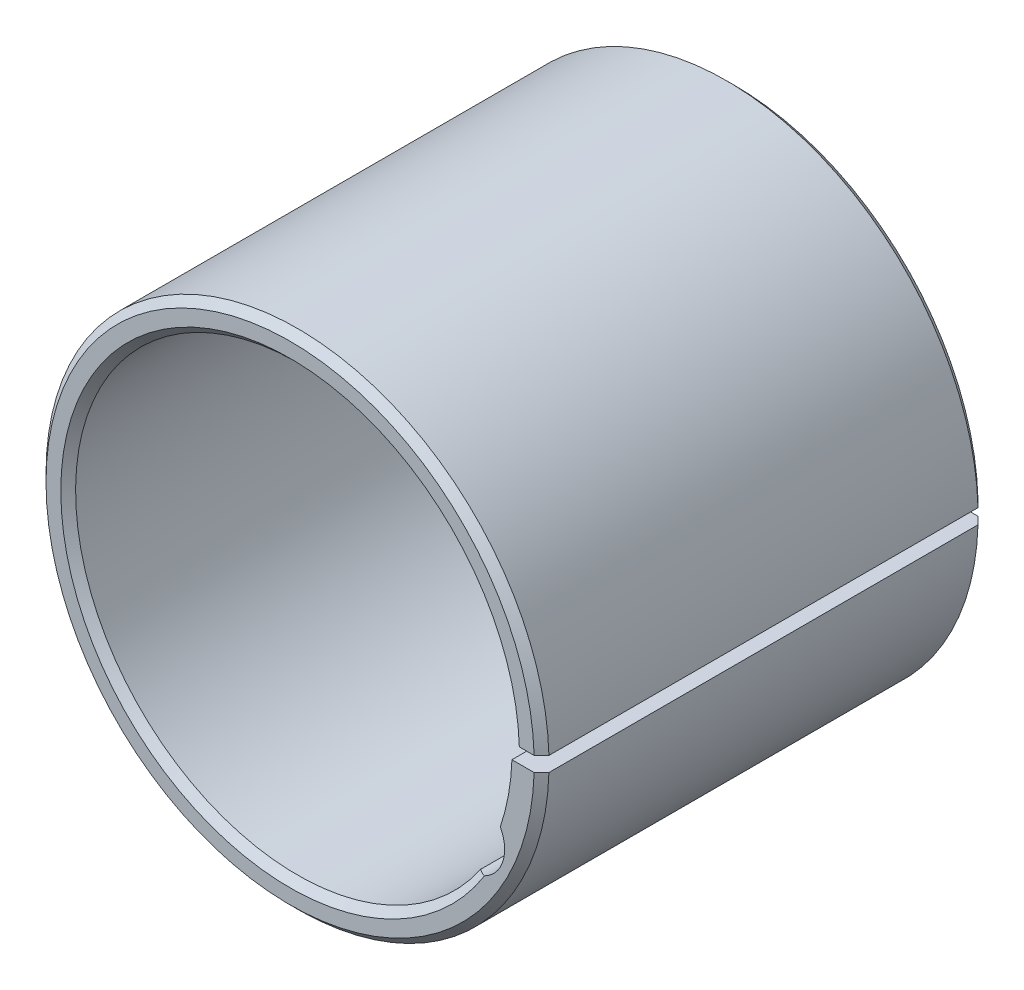
ISO-10303-21;
HEADER;
FILE_DESCRIPTION(('STEP AP214'),'2;1');
FILE_NAME('part.step','',(''),(''),'','','');
FILE_SCHEMA(('AUTOMOTIVE_DESIGN { 1 0 10303 214 1 1 1 1 }'));
ENDSEC;
DATA;
#1=APPLICATION_CONTEXT('core data for automotive mechanical design processes');
#2=APPLICATION_PROTOCOL_DEFINITION('international standard','automotive_design',2000,#1);
#3=PRODUCT_CONTEXT('',#1,'mechanical');
#4=PRODUCT('Part','Part','',(#3));
#5=PRODUCT_RELATED_PRODUCT_CATEGORY('part','',(#4));
#6=PRODUCT_DEFINITION_FORMATION('','',#4);
#7=PRODUCT_DEFINITION_CONTEXT('part definition',#1,'design');
#8=PRODUCT_DEFINITION('design','',#6,#7);
#9=PRODUCT_DEFINITION_SHAPE('','',#8);
#10=(LENGTH_UNIT() NAMED_UNIT(*) SI_UNIT(.MILLI.,.METRE.));
#11=(NAMED_UNIT(*) PLANE_ANGLE_UNIT() SI_UNIT($,.RADIAN.));
#12=(NAMED_UNIT(*) SI_UNIT($,.STERADIAN.) SOLID_ANGLE_UNIT());
#13=UNCERTAINTY_MEASURE_WITH_UNIT(LENGTH_MEASURE(1.E-05),#10,'distance_accuracy_value','');
#14=(GEOMETRIC_REPRESENTATION_CONTEXT(3) GLOBAL_UNCERTAINTY_ASSIGNED_CONTEXT((#13)) GLOBAL_UNIT_ASSIGNED_CONTEXT((#10,
#11,#12)) REPRESENTATION_CONTEXT('',''));
#15=CARTESIAN_POINT('',(0.,0.,0.));
#16=DIRECTION('',(0.,0.,1.));
#17=DIRECTION('',(1.,0.,0.));
#18=AXIS2_PLACEMENT_3D('',#15,#16,#17);
#19=CARTESIAN_POINT('',(0.,0.,30.));
#20=DIRECTION('',(0.,0.,-1.));
#21=DIRECTION('',(-1.,0.,0.));
#22=AXIS2_PLACEMENT_3D('',#19,#20,#21);
#23=CYLINDRICAL_SURFACE('',#22,15.);
#24=CARTESIAN_POINT('',(0.,0.,0.));
#25=DIRECTION('',(0.,0.,-1.));
#26=DIRECTION('',(1.,0.,0.));
#27=AXIS2_PLACEMENT_3D('',#24,#25,#26);
#28=CIRCLE('',#27,15.);
#29=CARTESIAN_POINT('',(14.9916643505649,-0.5,0.));
#30=VERTEX_POINT('',#29);
#31=CARTESIAN_POINT('',(14.2042998380754,-4.82056699051586,0.));
#32=VERTEX_POINT('',#31);
#33=EDGE_CURVE('E136',#30,#32,#28,.T.);
#34=ORIENTED_EDGE('',*,*,#33,.T.);
#35=DIRECTION('',(0.,0.,-1.));
#36=VECTOR('',#35,1.);
#37=CARTESIAN_POINT('',(14.2042998380754,-4.82056699051586,30.));
#38=LINE('',#37,#36);
#39=CARTESIAN_POINT('',(14.2042998380754,-4.82056699051586,30.));
#40=VERTEX_POINT('',#39);
#41=EDGE_CURVE('E114',#40,#32,#38,.T.);
#42=ORIENTED_EDGE('',*,*,#41,.F.);
#43=CARTESIAN_POINT('',(0.,0.,30.));
#44=DIRECTION('',(0.,0.,-1.));
#45=DIRECTION('',(1.,0.,0.));
#46=AXIS2_PLACEMENT_3D('',#43,#44,#45);
#47=CIRCLE('',#46,15.);
#48=CARTESIAN_POINT('',(14.9916643505649,-0.5,30.));
#49=VERTEX_POINT('',#48);
#50=EDGE_CURVE('E122',#49,#40,#47,.T.);
#51=ORIENTED_EDGE('',*,*,#50,.F.);
#52=DIRECTION('',(0.,0.,-1.));
#53=VECTOR('',#52,1.);
#54=CARTESIAN_POINT('',(14.9916643505649,-0.5,30.));
#55=LINE('',#54,#53);
#56=EDGE_CURVE('E343',#49,#30,#55,.T.);
#57=ORIENTED_EDGE('',*,*,#56,.T.);
#58=EDGE_LOOP('',(#34,#42,#51,#57));
#59=FACE_BOUND('',#58,.T.);
#60=ADVANCED_FACE('F33',(#59),#23,.F.);
#61=CARTESIAN_POINT('',(12.,-6.,30.));
#62=DIRECTION('',(0.,0.,-1.));
#63=DIRECTION('',(-1.,0.,0.));
#64=AXIS2_PLACEMENT_3D('',#61,#62,#63);
#65=CYLINDRICAL_SURFACE('',#64,2.50000000000001);
#66=DIRECTION('',(0.,0.,-1.));
#67=VECTOR('',#66,1.);
#68=CARTESIAN_POINT('',(12.3790334952579,-8.4710996761508,30.));
#69=LINE('',#68,#67);
#70=CARTESIAN_POINT('',(12.3790334952579,-8.4710996761508,29.5));
#71=VERTEX_POINT('',#70);
#72=CARTESIAN_POINT('',(12.3790334952579,-8.4710996761508,0.500000000000004));
#73=VERTEX_POINT('',#72);
#74=EDGE_CURVE('E138',#71,#73,#69,.T.);
#75=ORIENTED_EDGE('',*,*,#74,.F.);
#76=CARTESIAN_POINT('',(12.3790334952579,-8.4710996761508,29.5));
#77=CARTESIAN_POINT('',(12.4419990720707,-8.46143962877372,29.5465099858315));
#78=CARTESIAN_POINT('',(12.5053121402905,-8.44926617135896,29.5920731407119));
#79=CARTESIAN_POINT('',(12.6318755435432,-8.41969719701702,29.6806890370668));
#80=CARTESIAN_POINT('',(12.6951239320936,-8.40233378472329,29.7237553227428));
#81=CARTESIAN_POINT('',(12.8215860367125,-8.36207497920166,29.8073417560842));
#82=CARTESIAN_POINT('',(12.8847997426485,-8.33917841943337,29.8478613645668));
#83=CARTESIAN_POINT('',(13.011075849854,-8.28744625967742,29.9261702354581));
#84=CARTESIAN_POINT('',(13.0741349754203,-8.25857528007341,29.9639413330542));
#85=CARTESIAN_POINT('',(13.1366750419289,-8.22664991614216,30.));
#86=B_SPLINE_CURVE_WITH_KNOTS('',3,(#76,#77,#78,#79,#80,#81,#82,#83,#84,#85),.UNSPECIFIED.,.F.,
.F.,(4,2,2,2,4),(0.,0.236615380815331,0.471796348060221,0.707026941274795,0.94369258458161),.UNSPECIFIED.);
#87=CARTESIAN_POINT('',(13.1366750419289,-8.22664991614216,30.));
#88=VERTEX_POINT('',#87);
#89=EDGE_CURVE('E117',#71,#88,#86,.T.);
#90=ORIENTED_EDGE('',*,*,#89,.T.);
#91=CARTESIAN_POINT('',(12.,-6.,30.));
#92=DIRECTION('',(0.,0.,-1.));
#93=DIRECTION('',(1.,0.,0.));
#94=AXIS2_PLACEMENT_3D('',#91,#92,#93);
#95=CIRCLE('',#94,2.50000000000001);
#96=EDGE_CURVE('E110',#40,#88,#95,.T.);
#97=ORIENTED_EDGE('',*,*,#96,.F.);
#98=ORIENTED_EDGE('',*,*,#41,.T.);
#99=CARTESIAN_POINT('',(12.,-6.,0.));
#100=DIRECTION('',(0.,0.,-1.));
#101=DIRECTION('',(1.,0.,0.));
#102=AXIS2_PLACEMENT_3D('',#99,#100,#101);
#103=CIRCLE('',#102,2.50000000000001);
#104=CARTESIAN_POINT('',(13.1366750419289,-8.22664991614216,0.));
#105=VERTEX_POINT('',#104);
#106=EDGE_CURVE('E339',#32,#105,#103,.T.);
#107=ORIENTED_EDGE('',*,*,#106,.T.);
#108=CARTESIAN_POINT('',(13.1366750419289,-8.22664991614216,0.));
#109=CARTESIAN_POINT('',(13.0741349754203,-8.25857528007341,0.0360586669457851));
#110=CARTESIAN_POINT('',(13.011075849854,-8.28744625967742,0.0738297645418847));
#111=CARTESIAN_POINT('',(12.8847997426485,-8.33917841943337,0.15213863543315));
#112=CARTESIAN_POINT('',(12.8215860367125,-8.36207497920166,0.192658243915792));
#113=CARTESIAN_POINT('',(12.6951239320936,-8.40233378472329,0.276244677257232));
#114=CARTESIAN_POINT('',(12.6318755435432,-8.41969719701702,0.319310962933181));
#115=CARTESIAN_POINT('',(12.5053121402905,-8.44926617135896,0.407926859288096));
#116=CARTESIAN_POINT('',(12.4419990720707,-8.46143962877372,0.45349001416854));
#117=CARTESIAN_POINT('',(12.3790334952579,-8.4710996761508,0.500000000000003));
#118=B_SPLINE_CURVE_WITH_KNOTS('',3,(#108,#109,#110,#111,#112,#113,#114,#115,#116,#117),
.UNSPECIFIED.,.F.,.F.,(4,2,2,2,4),(0.,0.236665643306814,0.471896236521391,0.70707720376628,
0.94369258458161),.UNSPECIFIED.);
#119=EDGE_CURVE('E55',#105,#73,#118,.T.);
#120=ORIENTED_EDGE('',*,*,#119,.T.);
#121=EDGE_LOOP('',(#75,#90,#97,#98,#107,#120));
#122=FACE_BOUND('',#121,.T.);
#123=ADVANCED_FACE('F112',(#122),#65,.F.);
#124=CARTESIAN_POINT('',(0.,0.,30.));
#125=DIRECTION('',(0.,0.,-1.));
#126=DIRECTION('',(-1.,0.,0.));
#127=AXIS2_PLACEMENT_3D('',#124,#125,#126);
#128=CYLINDRICAL_SURFACE('',#127,15.);
#129=DIRECTION('',(0.,0.,-1.));
#130=VECTOR('',#129,1.);
#131=CARTESIAN_POINT('',(14.9916643505649,0.5,30.));
#132=LINE('',#131,#130);
#133=CARTESIAN_POINT('',(14.9916643505649,0.5,29.5));
#134=VERTEX_POINT('',#133);
#135=CARTESIAN_POINT('',(14.9916643505649,0.5,0.500000000000005));
#136=VERTEX_POINT('',#135);
#137=EDGE_CURVE('E142',#134,#136,#132,.T.);
#138=ORIENTED_EDGE('',*,*,#137,.F.);
#139=CARTESIAN_POINT('',(0.,0.,29.5));
#140=DIRECTION('',(0.,0.,1.));
#141=DIRECTION('',(1.,0.,0.));
#142=AXIS2_PLACEMENT_3D('',#139,#140,#141);
#143=CIRCLE('',#142,15.);
#144=EDGE_CURVE('E313',#134,#71,#143,.T.);
#145=ORIENTED_EDGE('',*,*,#144,.T.);
#146=ORIENTED_EDGE('',*,*,#74,.T.);
#147=CARTESIAN_POINT('',(0.,0.,0.500000000000004));
#148=DIRECTION('',(0.,0.,1.));
#149=DIRECTION('',(1.,0.,0.));
#150=AXIS2_PLACEMENT_3D('',#147,#148,#149);
#151=CIRCLE('',#150,15.);
#152=EDGE_CURVE('E312',#73,#136,#151,.F.);
#153=ORIENTED_EDGE('',*,*,#152,.T.);
#154=EDGE_LOOP('',(#138,#145,#146,#153));
#155=FACE_BOUND('',#154,.T.);
#156=ADVANCED_FACE('F179',(#155),#128,.F.);
#157=CARTESIAN_POINT('',(14.9916643505649,0.5,30.));
#158=DIRECTION('',(0.,1.,0.));
#159=DIRECTION('',(0.,0.,1.));
#160=AXIS2_PLACEMENT_3D('',#157,#158,#159);
#161=PLANE('',#160);
#162=DIRECTION('',(0.,0.,-1.));
#163=VECTOR('',#162,1.);
#164=CARTESIAN_POINT('',(16.9926454679664,0.5,30.));
#165=LINE('',#164,#163);
#166=CARTESIAN_POINT('',(16.9926454679664,0.5,29.5));
#167=VERTEX_POINT('',#166);
#168=CARTESIAN_POINT('',(16.9926454679664,0.5,0.500000000000004));
#169=VERTEX_POINT('',#168);
#170=EDGE_CURVE('E321',#167,#169,#165,.T.);
#171=ORIENTED_EDGE('',*,*,#170,.F.);
#172=CARTESIAN_POINT('',(16.9926454679664,0.5,29.5));
#173=CARTESIAN_POINT('',(16.9092755284813,0.5,29.5833338883448));
#174=CARTESIAN_POINT('',(16.8259053116141,0.5,29.6666674991839));
#175=CARTESIAN_POINT('',(16.6591643231155,0.5,29.8333341658506));
#176=CARTESIAN_POINT('',(16.5757935514841,0.5,29.9166672216782));
#177=CARTESIAN_POINT('',(16.4924225024706,0.5,30.));
#178=B_SPLINE_CURVE_WITH_KNOTS('',3,(#172,#173,#174,#175,#176,#177),.UNSPECIFIED.,.F.,.F.,(4,2,
4),(0.,0.353632229588448,0.707264459177012),.UNSPECIFIED.);
#179=CARTESIAN_POINT('',(16.4924225024706,0.5,30.));
#180=VERTEX_POINT('',#179);
#181=EDGE_CURVE('E202',#167,#180,#178,.T.);
#182=ORIENTED_EDGE('',*,*,#181,.T.);
#183=DIRECTION('',(1.,0.,0.));
#184=VECTOR('',#183,1.);
#185=CARTESIAN_POINT('',(14.9916643505649,0.5,30.));
#186=LINE('',#185,#184);
#187=CARTESIAN_POINT('',(15.4919333848297,0.5,30.));
#188=VERTEX_POINT('',#187);
#189=EDGE_CURVE('E121',#188,#180,#186,.T.);
#190=ORIENTED_EDGE('',*,*,#189,.F.);
#191=CARTESIAN_POINT('',(15.4919333848297,0.5,30.));
#192=CARTESIAN_POINT('',(15.4085559477162,0.5,29.9166659310071));
#193=CARTESIAN_POINT('',(15.3251781429707,0.5,29.833332229844));
#194=CARTESIAN_POINT('',(15.1584217982158,0.5,29.6666655631774));
#195=CARTESIAN_POINT('',(15.0750432582064,0.5,29.5833325976738));
#196=CARTESIAN_POINT('',(14.9916643505649,0.5,29.5));
#197=B_SPLINE_CURVE_WITH_KNOTS('',3,(#191,#192,#193,#194,#195,#196),.UNSPECIFIED.,.F.,.F.,(4,2,
4),(0.,0.353648521364637,0.707297042729504),.UNSPECIFIED.);
#198=EDGE_CURVE('E198',#188,#134,#197,.T.);
#199=ORIENTED_EDGE('',*,*,#198,.T.);
#200=ORIENTED_EDGE('',*,*,#137,.T.);
#201=CARTESIAN_POINT('',(14.9916643505649,0.5,0.500000000000004));
#202=CARTESIAN_POINT('',(15.0750432582064,0.5,0.416667402326214));
#203=CARTESIAN_POINT('',(15.1584217982158,0.5,0.333334436822639));
#204=CARTESIAN_POINT('',(15.3251781429707,0.5,0.166667770155971));
#205=CARTESIAN_POINT('',(15.4085559477162,0.5,0.0833340689928784));
#206=CARTESIAN_POINT('',(15.4919333848297,0.5,0.));
#207=B_SPLINE_CURVE_WITH_KNOTS('',3,(#201,#202,#203,#204,#205,#206),.UNSPECIFIED.,.F.,.F.,(4,2,
4),(0.,0.353648521364865,0.707297042729505),.UNSPECIFIED.);
#208=CARTESIAN_POINT('',(15.4919333848297,0.5,0.));
#209=VERTEX_POINT('',#208);
#210=EDGE_CURVE('E185',#136,#209,#207,.T.);
#211=ORIENTED_EDGE('',*,*,#210,.T.);
#212=DIRECTION('',(1.,0.,0.));
#213=VECTOR('',#212,1.);
#214=CARTESIAN_POINT('',(14.9916643505649,0.5,0.));
#215=LINE('',#214,#213);
#216=CARTESIAN_POINT('',(16.4924225024706,0.5,0.));
#217=VERTEX_POINT('',#216);
#218=EDGE_CURVE('E333',#209,#217,#215,.T.);
#219=ORIENTED_EDGE('',*,*,#218,.T.);
#220=CARTESIAN_POINT('',(16.4924225024706,0.5,0.));
#221=CARTESIAN_POINT('',(16.5757935514841,0.5,0.0833327783218146));
#222=CARTESIAN_POINT('',(16.6591643231155,0.5,0.166665834149396));
#223=CARTESIAN_POINT('',(16.8259053116141,0.5,0.333332500816064));
#224=CARTESIAN_POINT('',(16.9092755284813,0.5,0.41666611165515));
#225=CARTESIAN_POINT('',(16.9926454679664,0.5,0.500000000000003));
#226=B_SPLINE_CURVE_WITH_KNOTS('',3,(#220,#221,#222,#223,#224,#225),.UNSPECIFIED.,.F.,.F.,(4,2,
4),(0.,0.353632229588566,0.707264459177011),.UNSPECIFIED.);
#227=EDGE_CURVE('E193',#217,#169,#226,.T.);
#228=ORIENTED_EDGE('',*,*,#227,.T.);
#229=EDGE_LOOP('',(#171,#182,#190,#199,#200,#211,#219,#228));
#230=FACE_BOUND('',#229,.T.);
#231=ADVANCED_FACE('F174',(#230),#161,.F.);
#232=CARTESIAN_POINT('',(0.,0.,30.));
#233=DIRECTION('',(0.,0.,-1.));
#234=DIRECTION('',(-1.,0.,0.));
#235=AXIS2_PLACEMENT_3D('',#232,#233,#234);
#236=CYLINDRICAL_SURFACE('',#235,17.);
#237=DIRECTION('',(0.,0.,-1.));
#238=VECTOR('',#237,1.);
#239=CARTESIAN_POINT('',(16.9926454679664,-0.499999999999998,30.));
#240=LINE('',#239,#238);
#241=CARTESIAN_POINT('',(16.9926454679664,-0.499999999999998,29.5));
#242=VERTEX_POINT('',#241);
#243=CARTESIAN_POINT('',(16.9926454679664,-0.499999999999998,0.500000000000004));
#244=VERTEX_POINT('',#243);
#245=EDGE_CURVE('E335',#242,#244,#240,.T.);
#246=ORIENTED_EDGE('',*,*,#245,.F.);
#247=CARTESIAN_POINT('',(0.,0.,29.5));
#248=DIRECTION('',(0.,0.,1.));
#249=DIRECTION('',(1.,0.,0.));
#250=AXIS2_PLACEMENT_3D('',#247,#248,#249);
#251=CIRCLE('',#250,17.);
#252=EDGE_CURVE('E325',#242,#167,#251,.F.);
#253=ORIENTED_EDGE('',*,*,#252,.T.);
#254=ORIENTED_EDGE('',*,*,#170,.T.);
#255=CARTESIAN_POINT('',(0.,0.,0.500000000000004));
#256=DIRECTION('',(0.,0.,1.));
#257=DIRECTION('',(1.,0.,0.));
#258=AXIS2_PLACEMENT_3D('',#255,#256,#257);
#259=CIRCLE('',#258,17.);
#260=EDGE_CURVE('E328',#169,#244,#259,.T.);
#261=ORIENTED_EDGE('',*,*,#260,.T.);
#262=EDGE_LOOP('',(#246,#253,#254,#261));
#263=FACE_BOUND('',#262,.T.);
#264=ADVANCED_FACE('F167',(#263),#236,.T.);
#265=CARTESIAN_POINT('',(14.9916643505649,-0.5,30.));
#266=DIRECTION('',(0.,-1.,0.));
#267=DIRECTION('',(0.,0.,-1.));
#268=AXIS2_PLACEMENT_3D('',#265,#266,#267);
#269=PLANE('',#268);
#270=DIRECTION('',(-1.,0.,0.));
#271=VECTOR('',#270,1.);
#272=CARTESIAN_POINT('',(14.9916643505649,-0.5,30.));
#273=LINE('',#272,#271);
#274=CARTESIAN_POINT('',(16.4924225024706,-0.5,30.));
#275=VERTEX_POINT('',#274);
#276=EDGE_CURVE('E129',#275,#49,#273,.T.);
#277=ORIENTED_EDGE('',*,*,#276,.F.);
#278=CARTESIAN_POINT('',(16.4924225024706,-0.5,30.));
#279=CARTESIAN_POINT('',(16.5757935514841,-0.5,29.9166672216782));
#280=CARTESIAN_POINT('',(16.6591643231155,-0.5,29.8333341658506));
#281=CARTESIAN_POINT('',(16.8259053116141,-0.5,29.6666674991839));
#282=CARTESIAN_POINT('',(16.9092755284813,-0.5,29.5833338883448));
#283=CARTESIAN_POINT('',(16.9926454679664,-0.5,29.5));
#284=B_SPLINE_CURVE_WITH_KNOTS('',3,(#278,#279,#280,#281,#282,#283),.UNSPECIFIED.,.F.,.F.,(4,2,
4),(0.,0.353632229588563,0.707264459177012),.UNSPECIFIED.);
#285=EDGE_CURVE('E153',#275,#242,#284,.T.);
#286=ORIENTED_EDGE('',*,*,#285,.T.);
#287=ORIENTED_EDGE('',*,*,#245,.T.);
#288=CARTESIAN_POINT('',(16.9926454679664,-0.499999999999998,0.500000000000004));
#289=CARTESIAN_POINT('',(16.9092755284813,-0.499999999999999,0.416666111655151));
#290=CARTESIAN_POINT('',(16.8259053116141,-0.5,0.333332500816064));
#291=CARTESIAN_POINT('',(16.6591643231155,-0.5,0.166665834149397));
#292=CARTESIAN_POINT('',(16.5757935514841,-0.5,0.0833327783218153));
#293=CARTESIAN_POINT('',(16.4924225024706,-0.5,0.));
#294=B_SPLINE_CURVE_WITH_KNOTS('',3,(#288,#289,#290,#291,#292,#293),.UNSPECIFIED.,.F.,.F.,(4,2,
4),(0.,0.353632229588445,0.707264459177011),.UNSPECIFIED.);
#295=CARTESIAN_POINT('',(16.4924225024706,-0.5,0.));
#296=VERTEX_POINT('',#295);
#297=EDGE_CURVE('E147',#244,#296,#294,.T.);
#298=ORIENTED_EDGE('',*,*,#297,.T.);
#299=DIRECTION('',(-1.,0.,0.));
#300=VECTOR('',#299,1.);
#301=CARTESIAN_POINT('',(14.9916643505649,-0.5,0.));
#302=LINE('',#301,#300);
#303=EDGE_CURVE('E133',#296,#30,#302,.T.);
#304=ORIENTED_EDGE('',*,*,#303,.T.);
#305=ORIENTED_EDGE('',*,*,#56,.F.);
#306=EDGE_LOOP('',(#277,#286,#287,#298,#304,#305));
#307=FACE_BOUND('',#306,.T.);
#308=ADVANCED_FACE('F162',(#307),#269,.F.);
#309=CARTESIAN_POINT('',(0.,0.,30.));
#310=DIRECTION('',(0.,0.,1.));
#311=DIRECTION('',(1.,0.,0.));
#312=AXIS2_PLACEMENT_3D('',#309,#310,#311);
#313=PLANE('',#312);
#314=ORIENTED_EDGE('',*,*,#189,.T.);
#315=CARTESIAN_POINT('',(0.,0.,30.));
#316=DIRECTION('',(0.,0.,1.));
#317=DIRECTION('',(1.,0.,0.));
#318=AXIS2_PLACEMENT_3D('',#315,#316,#317);
#319=CIRCLE('',#318,16.5);
#320=EDGE_CURVE('E140',#180,#275,#319,.T.);
#321=ORIENTED_EDGE('',*,*,#320,.T.);
#322=ORIENTED_EDGE('',*,*,#276,.T.);
#323=ORIENTED_EDGE('',*,*,#50,.T.);
#324=ORIENTED_EDGE('',*,*,#96,.T.);
#325=CARTESIAN_POINT('',(0.,0.,30.));
#326=DIRECTION('',(0.,0.,1.));
#327=DIRECTION('',(1.,0.,0.));
#328=AXIS2_PLACEMENT_3D('',#325,#326,#327);
#329=CIRCLE('',#328,15.5);
#330=EDGE_CURVE('E137',#88,#188,#329,.F.);
#331=ORIENTED_EDGE('',*,*,#330,.T.);
#332=EDGE_LOOP('',(#314,#321,#322,#323,#324,#331));
#333=FACE_BOUND('',#332,.T.);
#334=ADVANCED_FACE('F126',(#333),#313,.T.);
#335=CARTESIAN_POINT('',(0.,0.,0.));
#336=DIRECTION('',(0.,0.,1.));
#337=DIRECTION('',(1.,0.,0.));
#338=AXIS2_PLACEMENT_3D('',#335,#336,#337);
#339=PLANE('',#338);
#340=ORIENTED_EDGE('',*,*,#303,.F.);
#341=CARTESIAN_POINT('',(0.,0.,0.));
#342=DIRECTION('',(0.,0.,1.));
#343=DIRECTION('',(1.,0.,0.));
#344=AXIS2_PLACEMENT_3D('',#341,#342,#343);
#345=CIRCLE('',#344,16.5);
#346=EDGE_CURVE('E11',#296,#217,#345,.F.);
#347=ORIENTED_EDGE('',*,*,#346,.T.);
#348=ORIENTED_EDGE('',*,*,#218,.F.);
#349=CARTESIAN_POINT('',(0.,0.,0.));
#350=DIRECTION('',(0.,0.,1.));
#351=DIRECTION('',(1.,0.,0.));
#352=AXIS2_PLACEMENT_3D('',#349,#350,#351);
#353=CIRCLE('',#352,15.5);
#354=EDGE_CURVE('E42',#209,#105,#353,.T.);
#355=ORIENTED_EDGE('',*,*,#354,.T.);
#356=ORIENTED_EDGE('',*,*,#106,.F.);
#357=ORIENTED_EDGE('',*,*,#33,.F.);
#358=EDGE_LOOP('',(#340,#347,#348,#355,#356,#357));
#359=FACE_BOUND('',#358,.T.);
#360=ADVANCED_FACE('F169',(#359),#339,.F.);
#361=CARTESIAN_POINT('',(0.,0.,30.));
#362=DIRECTION('',(0.,0.,-1.));
#363=DIRECTION('',(-1.,0.,0.));
#364=AXIS2_PLACEMENT_3D('',#361,#362,#363);
#365=CONICAL_SURFACE('',#364,16.5,0.785398163397445);
#366=ORIENTED_EDGE('',*,*,#181,.F.);
#367=ORIENTED_EDGE('',*,*,#252,.F.);
#368=ORIENTED_EDGE('',*,*,#285,.F.);
#369=ORIENTED_EDGE('',*,*,#320,.F.);
#370=EDGE_LOOP('',(#366,#367,#368,#369));
#371=FACE_BOUND('',#370,.T.);
#372=ADVANCED_FACE('F210',(#371),#365,.T.);
#373=CARTESIAN_POINT('',(0.,0.,30.));
#374=DIRECTION('',(0.,0.,1.));
#375=DIRECTION('',(1.,0.,0.));
#376=AXIS2_PLACEMENT_3D('',#373,#374,#375);
#377=CONICAL_SURFACE('',#376,15.5,0.785398163397453);
#378=ORIENTED_EDGE('',*,*,#89,.F.);
#379=ORIENTED_EDGE('',*,*,#144,.F.);
#380=ORIENTED_EDGE('',*,*,#198,.F.);
#381=ORIENTED_EDGE('',*,*,#330,.F.);
#382=EDGE_LOOP('',(#378,#379,#380,#381));
#383=FACE_BOUND('',#382,.T.);
#384=ADVANCED_FACE('F207',(#383),#377,.F.);
#385=CARTESIAN_POINT('',(0.,0.,0.500000000000004));
#386=DIRECTION('',(0.,0.,1.));
#387=DIRECTION('',(1.,0.,0.));
#388=AXIS2_PLACEMENT_3D('',#385,#386,#387);
#389=CONICAL_SURFACE('',#388,17.,0.785398163397452);
#390=ORIENTED_EDGE('',*,*,#227,.F.);
#391=ORIENTED_EDGE('',*,*,#346,.F.);
#392=ORIENTED_EDGE('',*,*,#297,.F.);
#393=ORIENTED_EDGE('',*,*,#260,.F.);
#394=EDGE_LOOP('',(#390,#391,#392,#393));
#395=FACE_BOUND('',#394,.T.);
#396=ADVANCED_FACE('F159',(#395),#389,.T.);
#397=CARTESIAN_POINT('',(0.,0.,0.500000000000004));
#398=DIRECTION('',(0.,0.,-1.));
#399=DIRECTION('',(-1.,0.,0.));
#400=AXIS2_PLACEMENT_3D('',#397,#398,#399);
#401=CONICAL_SURFACE('',#400,15.,0.785398163397453);
#402=ORIENTED_EDGE('',*,*,#119,.F.);
#403=ORIENTED_EDGE('',*,*,#354,.F.);
#404=ORIENTED_EDGE('',*,*,#210,.F.);
#405=ORIENTED_EDGE('',*,*,#152,.F.);
#406=EDGE_LOOP('',(#402,#403,#404,#405));
#407=FACE_BOUND('',#406,.T.);
#408=ADVANCED_FACE('F35',(#407),#401,.F.);
#409=CLOSED_SHELL('',(#60,#123,#156,#231,#264,#308,#334,#360,#372,#384,#396,#408));
#410=MANIFOLD_SOLID_BREP('B2',#409);
#411=ADVANCED_BREP_SHAPE_REPRESENTATION('',(#18,#410),#14);
#412=SHAPE_DEFINITION_REPRESENTATION(#9,#411);
ENDSEC;
END-ISO-10303-21;
